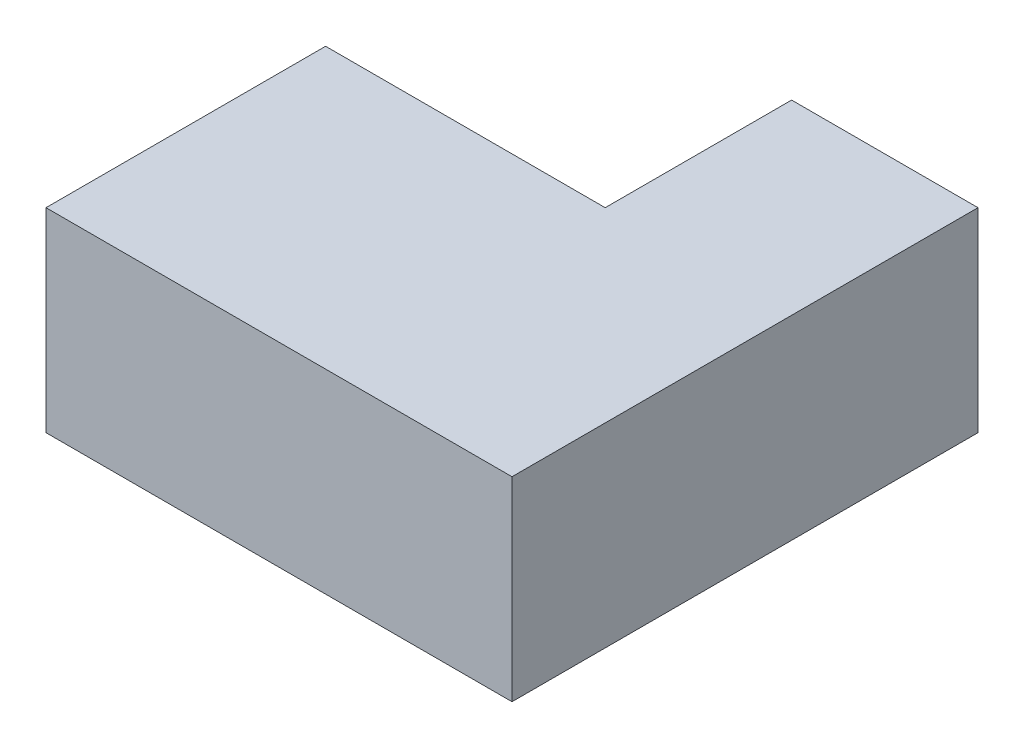
ISO-10303-21;
HEADER;
FILE_DESCRIPTION(('STEP AP214'),'2;1');
FILE_NAME('part.step','',(''),(''),'','','');
FILE_SCHEMA(('AUTOMOTIVE_DESIGN { 1 0 10303 214 1 1 1 1 }'));
ENDSEC;
DATA;
#1=APPLICATION_CONTEXT('core data for automotive mechanical design processes');
#2=APPLICATION_PROTOCOL_DEFINITION('international standard','automotive_design',2000,#1);
#3=PRODUCT_CONTEXT('',#1,'mechanical');
#4=PRODUCT('Part','Part','',(#3));
#5=PRODUCT_RELATED_PRODUCT_CATEGORY('part','',(#4));
#6=PRODUCT_DEFINITION_FORMATION('','',#4);
#7=PRODUCT_DEFINITION_CONTEXT('part definition',#1,'design');
#8=PRODUCT_DEFINITION('design','',#6,#7);
#9=PRODUCT_DEFINITION_SHAPE('','',#8);
#10=(LENGTH_UNIT() NAMED_UNIT(*) SI_UNIT(.MILLI.,.METRE.));
#11=(NAMED_UNIT(*) PLANE_ANGLE_UNIT() SI_UNIT($,.RADIAN.));
#12=(NAMED_UNIT(*) SI_UNIT($,.STERADIAN.) SOLID_ANGLE_UNIT());
#13=UNCERTAINTY_MEASURE_WITH_UNIT(LENGTH_MEASURE(1.E-05),#10,'distance_accuracy_value','');
#14=(GEOMETRIC_REPRESENTATION_CONTEXT(3) GLOBAL_UNCERTAINTY_ASSIGNED_CONTEXT((#13)) GLOBAL_UNIT_ASSIGNED_CONTEXT((#10,
#11,#12)) REPRESENTATION_CONTEXT('',''));
#15=CARTESIAN_POINT('',(0.,0.,0.));
#16=DIRECTION('',(0.,0.,1.));
#17=DIRECTION('',(1.,0.,0.));
#18=AXIS2_PLACEMENT_3D('',#15,#16,#17);
#19=CARTESIAN_POINT('',(0.,265.557,-762.));
#20=DIRECTION('',(1.,0.,0.));
#21=DIRECTION('',(0.,0.,-1.));
#22=AXIS2_PLACEMENT_3D('',#19,#20,#21);
#23=PLANE('',#22);
#24=DIRECTION('',(0.,0.,1.));
#25=VECTOR('',#24,1.);
#26=CARTESIAN_POINT('',(0.,-265.557,-762.));
#27=LINE('',#26,#25);
#28=CARTESIAN_POINT('',(0.,-265.557,-762.));
#29=VERTEX_POINT('',#28);
#30=CARTESIAN_POINT('',(0.,-265.557,0.));
#31=VERTEX_POINT('',#30);
#32=EDGE_CURVE('E121',#29,#31,#27,.T.);
#33=ORIENTED_EDGE('',*,*,#32,.T.);
#34=DIRECTION('',(0.,-1.,0.));
#35=VECTOR('',#34,1.);
#36=CARTESIAN_POINT('',(0.,265.557,0.));
#37=LINE('',#36,#35);
#38=CARTESIAN_POINT('',(0.,265.557,0.));
#39=VERTEX_POINT('',#38);
#40=EDGE_CURVE('E11',#39,#31,#37,.T.);
#41=ORIENTED_EDGE('',*,*,#40,.F.);
#42=DIRECTION('',(0.,0.,1.));
#43=VECTOR('',#42,1.);
#44=CARTESIAN_POINT('',(0.,265.557,-762.));
#45=LINE('',#44,#43);
#46=CARTESIAN_POINT('',(0.,265.557,-762.));
#47=VERTEX_POINT('',#46);
#48=EDGE_CURVE('E131',#47,#39,#45,.T.);
#49=ORIENTED_EDGE('',*,*,#48,.F.);
#50=DIRECTION('',(0.,-1.,0.));
#51=VECTOR('',#50,1.);
#52=CARTESIAN_POINT('',(0.,265.557,-762.));
#53=LINE('',#52,#51);
#54=EDGE_CURVE('E117',#47,#29,#53,.T.);
#55=ORIENTED_EDGE('',*,*,#54,.T.);
#56=EDGE_LOOP('',(#33,#41,#49,#55));
#57=FACE_BOUND('',#56,.T.);
#58=ADVANCED_FACE('F37',(#57),#23,.F.);
#59=CARTESIAN_POINT('',(0.,265.557,0.));
#60=DIRECTION('',(0.,0.,-1.));
#61=DIRECTION('',(-1.,0.,0.));
#62=AXIS2_PLACEMENT_3D('',#59,#60,#61);
#63=PLANE('',#62);
#64=DIRECTION('',(1.,0.,0.));
#65=VECTOR('',#64,1.);
#66=CARTESIAN_POINT('',(0.,-265.557,0.));
#67=LINE('',#66,#65);
#68=CARTESIAN_POINT('',(1270.,-265.557,0.));
#69=VERTEX_POINT('',#68);
#70=EDGE_CURVE('E124',#31,#69,#67,.T.);
#71=ORIENTED_EDGE('',*,*,#70,.T.);
#72=DIRECTION('',(0.,-1.,0.));
#73=VECTOR('',#72,1.);
#74=CARTESIAN_POINT('',(1270.,265.557,0.));
#75=LINE('',#74,#73);
#76=CARTESIAN_POINT('',(1270.,265.557,0.));
#77=VERTEX_POINT('',#76);
#78=EDGE_CURVE('E45',#77,#69,#75,.T.);
#79=ORIENTED_EDGE('',*,*,#78,.F.);
#80=DIRECTION('',(1.,0.,0.));
#81=VECTOR('',#80,1.);
#82=CARTESIAN_POINT('',(0.,265.557,0.));
#83=LINE('',#82,#81);
#84=EDGE_CURVE('E90',#39,#77,#83,.T.);
#85=ORIENTED_EDGE('',*,*,#84,.F.);
#86=ORIENTED_EDGE('',*,*,#40,.T.);
#87=EDGE_LOOP('',(#71,#79,#85,#86));
#88=FACE_BOUND('',#87,.T.);
#89=ADVANCED_FACE('F155',(#88),#63,.F.);
#90=CARTESIAN_POINT('',(1270.,265.557,0.));
#91=DIRECTION('',(-1.,0.,0.));
#92=DIRECTION('',(0.,0.,1.));
#93=AXIS2_PLACEMENT_3D('',#90,#91,#92);
#94=PLANE('',#93);
#95=DIRECTION('',(0.,0.,-1.));
#96=VECTOR('',#95,1.);
#97=CARTESIAN_POINT('',(1270.,-265.557,0.));
#98=LINE('',#97,#96);
#99=CARTESIAN_POINT('',(1270.,-265.557,-1270.));
#100=VERTEX_POINT('',#99);
#101=EDGE_CURVE('E126',#69,#100,#98,.T.);
#102=ORIENTED_EDGE('',*,*,#101,.T.);
#103=DIRECTION('',(0.,-1.,0.));
#104=VECTOR('',#103,1.);
#105=CARTESIAN_POINT('',(1270.,265.557,-1270.));
#106=LINE('',#105,#104);
#107=CARTESIAN_POINT('',(1270.,265.557,-1270.));
#108=VERTEX_POINT('',#107);
#109=EDGE_CURVE('E112',#108,#100,#106,.T.);
#110=ORIENTED_EDGE('',*,*,#109,.F.);
#111=DIRECTION('',(0.,0.,-1.));
#112=VECTOR('',#111,1.);
#113=CARTESIAN_POINT('',(1270.,265.557,0.));
#114=LINE('',#113,#112);
#115=EDGE_CURVE('E103',#77,#108,#114,.T.);
#116=ORIENTED_EDGE('',*,*,#115,.F.);
#117=ORIENTED_EDGE('',*,*,#78,.T.);
#118=EDGE_LOOP('',(#102,#110,#116,#117));
#119=FACE_BOUND('',#118,.T.);
#120=ADVANCED_FACE('F137',(#119),#94,.F.);
#121=CARTESIAN_POINT('',(1270.,265.557,-1270.));
#122=DIRECTION('',(0.,0.,1.));
#123=DIRECTION('',(1.,0.,0.));
#124=AXIS2_PLACEMENT_3D('',#121,#122,#123);
#125=PLANE('',#124);
#126=DIRECTION('',(-1.,0.,0.));
#127=VECTOR('',#126,1.);
#128=CARTESIAN_POINT('',(1270.,-265.557,-1270.));
#129=LINE('',#128,#127);
#130=CARTESIAN_POINT('',(762.,-265.557,-1270.));
#131=VERTEX_POINT('',#130);
#132=EDGE_CURVE('E111',#100,#131,#129,.T.);
#133=ORIENTED_EDGE('',*,*,#132,.T.);
#134=DIRECTION('',(0.,-1.,0.));
#135=VECTOR('',#134,1.);
#136=CARTESIAN_POINT('',(762.,265.557,-1270.));
#137=LINE('',#136,#135);
#138=CARTESIAN_POINT('',(762.,265.557,-1270.));
#139=VERTEX_POINT('',#138);
#140=EDGE_CURVE('E108',#139,#131,#137,.T.);
#141=ORIENTED_EDGE('',*,*,#140,.F.);
#142=DIRECTION('',(-1.,0.,0.));
#143=VECTOR('',#142,1.);
#144=CARTESIAN_POINT('',(1270.,265.557,-1270.));
#145=LINE('',#144,#143);
#146=EDGE_CURVE('E97',#108,#139,#145,.T.);
#147=ORIENTED_EDGE('',*,*,#146,.F.);
#148=ORIENTED_EDGE('',*,*,#109,.T.);
#149=EDGE_LOOP('',(#133,#141,#147,#148));
#150=FACE_BOUND('',#149,.T.);
#151=ADVANCED_FACE('F109',(#150),#125,.F.);
#152=CARTESIAN_POINT('',(762.,265.557,-1270.));
#153=DIRECTION('',(1.,0.,0.));
#154=DIRECTION('',(0.,0.,-1.));
#155=AXIS2_PLACEMENT_3D('',#152,#153,#154);
#156=PLANE('',#155);
#157=DIRECTION('',(0.,0.,1.));
#158=VECTOR('',#157,1.);
#159=CARTESIAN_POINT('',(762.,-265.557,-1270.));
#160=LINE('',#159,#158);
#161=CARTESIAN_POINT('',(762.,-265.557,-762.));
#162=VERTEX_POINT('',#161);
#163=EDGE_CURVE('E76',#131,#162,#160,.T.);
#164=ORIENTED_EDGE('',*,*,#163,.T.);
#165=DIRECTION('',(0.,-1.,0.));
#166=VECTOR('',#165,1.);
#167=CARTESIAN_POINT('',(762.,265.557,-762.));
#168=LINE('',#167,#166);
#169=CARTESIAN_POINT('',(762.,265.557,-762.));
#170=VERTEX_POINT('',#169);
#171=EDGE_CURVE('E113',#170,#162,#168,.T.);
#172=ORIENTED_EDGE('',*,*,#171,.F.);
#173=DIRECTION('',(0.,0.,1.));
#174=VECTOR('',#173,1.);
#175=CARTESIAN_POINT('',(762.,265.557,-1270.));
#176=LINE('',#175,#174);
#177=EDGE_CURVE('E101',#139,#170,#176,.T.);
#178=ORIENTED_EDGE('',*,*,#177,.F.);
#179=ORIENTED_EDGE('',*,*,#140,.T.);
#180=EDGE_LOOP('',(#164,#172,#178,#179));
#181=FACE_BOUND('',#180,.T.);
#182=ADVANCED_FACE('F115',(#181),#156,.F.);
#183=CARTESIAN_POINT('',(762.,265.557,-762.));
#184=DIRECTION('',(0.,0.,1.));
#185=DIRECTION('',(1.,0.,0.));
#186=AXIS2_PLACEMENT_3D('',#183,#184,#185);
#187=PLANE('',#186);
#188=DIRECTION('',(-1.,0.,0.));
#189=VECTOR('',#188,1.);
#190=CARTESIAN_POINT('',(762.,-265.557,-762.));
#191=LINE('',#190,#189);
#192=EDGE_CURVE('E82',#162,#29,#191,.T.);
#193=ORIENTED_EDGE('',*,*,#192,.T.);
#194=ORIENTED_EDGE('',*,*,#54,.F.);
#195=DIRECTION('',(-1.,0.,0.));
#196=VECTOR('',#195,1.);
#197=CARTESIAN_POINT('',(762.,265.557,-762.));
#198=LINE('',#197,#196);
#199=EDGE_CURVE('E53',#170,#47,#198,.T.);
#200=ORIENTED_EDGE('',*,*,#199,.F.);
#201=ORIENTED_EDGE('',*,*,#171,.T.);
#202=EDGE_LOOP('',(#193,#194,#200,#201));
#203=FACE_BOUND('',#202,.T.);
#204=ADVANCED_FACE('F144',(#203),#187,.F.);
#205=CARTESIAN_POINT('',(0.,265.557,0.));
#206=DIRECTION('',(0.,1.,0.));
#207=DIRECTION('',(0.,0.,1.));
#208=AXIS2_PLACEMENT_3D('',#205,#206,#207);
#209=PLANE('',#208);
#210=ORIENTED_EDGE('',*,*,#48,.T.);
#211=ORIENTED_EDGE('',*,*,#84,.T.);
#212=ORIENTED_EDGE('',*,*,#115,.T.);
#213=ORIENTED_EDGE('',*,*,#146,.T.);
#214=ORIENTED_EDGE('',*,*,#177,.T.);
#215=ORIENTED_EDGE('',*,*,#199,.T.);
#216=EDGE_LOOP('',(#210,#211,#212,#213,#214,#215));
#217=FACE_BOUND('',#216,.T.);
#218=ADVANCED_FACE('F99',(#217),#209,.T.);
#219=CARTESIAN_POINT('',(0.,-265.557,0.));
#220=DIRECTION('',(0.,1.,0.));
#221=DIRECTION('',(0.,0.,1.));
#222=AXIS2_PLACEMENT_3D('',#219,#220,#221);
#223=PLANE('',#222);
#224=ORIENTED_EDGE('',*,*,#32,.F.);
#225=ORIENTED_EDGE('',*,*,#192,.F.);
#226=ORIENTED_EDGE('',*,*,#163,.F.);
#227=ORIENTED_EDGE('',*,*,#132,.F.);
#228=ORIENTED_EDGE('',*,*,#101,.F.);
#229=ORIENTED_EDGE('',*,*,#70,.F.);
#230=EDGE_LOOP('',(#224,#225,#226,#227,#228,#229));
#231=FACE_BOUND('',#230,.T.);
#232=ADVANCED_FACE('F140',(#231),#223,.F.);
#233=CLOSED_SHELL('',(#58,#89,#120,#151,#182,#204,#218,#232));
#234=MANIFOLD_SOLID_BREP('B2',#233);
#235=ADVANCED_BREP_SHAPE_REPRESENTATION('',(#18,#234),#14);
#236=SHAPE_DEFINITION_REPRESENTATION(#9,#235);
ENDSEC;
END-ISO-10303-21;
